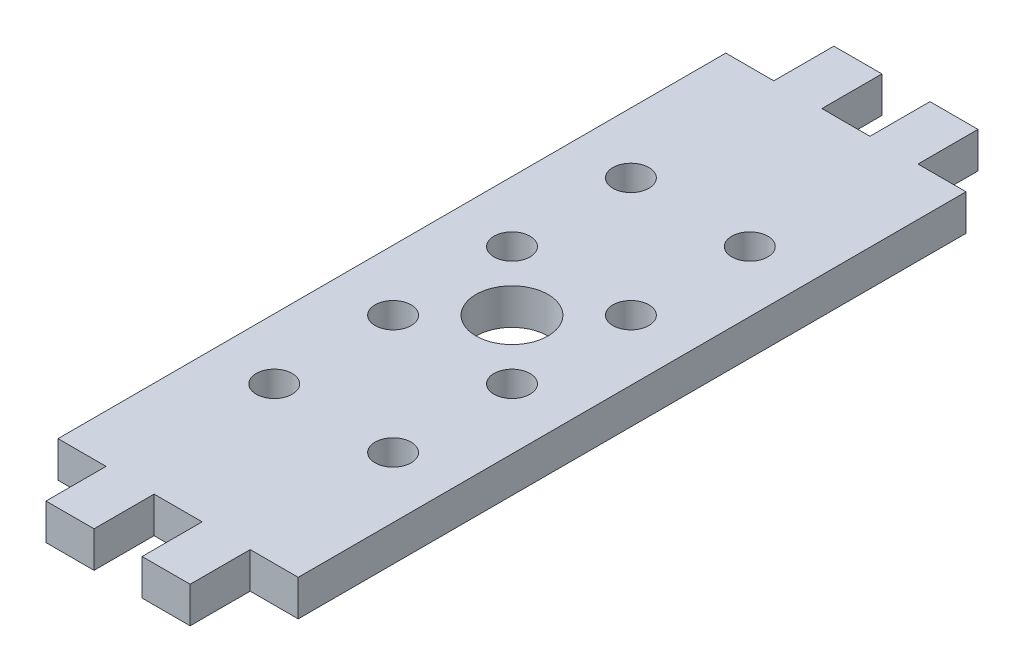
ISO-10303-21;
HEADER;
FILE_DESCRIPTION(('STEP AP214'),'2;1');
FILE_NAME('part.step','',(''),(''),'','','');
FILE_SCHEMA(('AUTOMOTIVE_DESIGN { 1 0 10303 214 1 1 1 1 }'));
ENDSEC;
DATA;
#1=APPLICATION_CONTEXT('core data for automotive mechanical design processes');
#2=APPLICATION_PROTOCOL_DEFINITION('international standard','automotive_design',2000,#1);
#3=PRODUCT_CONTEXT('',#1,'mechanical');
#4=PRODUCT('Part','Part','',(#3));
#5=PRODUCT_RELATED_PRODUCT_CATEGORY('part','',(#4));
#6=PRODUCT_DEFINITION_FORMATION('','',#4);
#7=PRODUCT_DEFINITION_CONTEXT('part definition',#1,'design');
#8=PRODUCT_DEFINITION('design','',#6,#7);
#9=PRODUCT_DEFINITION_SHAPE('','',#8);
#10=(LENGTH_UNIT() NAMED_UNIT(*) SI_UNIT(.MILLI.,.METRE.));
#11=(NAMED_UNIT(*) PLANE_ANGLE_UNIT() SI_UNIT($,.RADIAN.));
#12=(NAMED_UNIT(*) SI_UNIT($,.STERADIAN.) SOLID_ANGLE_UNIT());
#13=UNCERTAINTY_MEASURE_WITH_UNIT(LENGTH_MEASURE(1.E-05),#10,'distance_accuracy_value','');
#14=(GEOMETRIC_REPRESENTATION_CONTEXT(3) GLOBAL_UNCERTAINTY_ASSIGNED_CONTEXT((#13)) GLOBAL_UNIT_ASSIGNED_CONTEXT((#10,
#11,#12)) REPRESENTATION_CONTEXT('',''));
#15=CARTESIAN_POINT('',(0.,0.,0.));
#16=DIRECTION('',(0.,0.,1.));
#17=DIRECTION('',(1.,0.,0.));
#18=AXIS2_PLACEMENT_3D('',#15,#16,#17);
#19=CARTESIAN_POINT('',(0.,3.,0.));
#20=DIRECTION('',(0.,1.,0.));
#21=DIRECTION('',(0.,0.,1.));
#22=AXIS2_PLACEMENT_3D('',#19,#20,#21);
#23=PLANE('',#22);
#24=CARTESIAN_POINT('',(-14.9497474683059,3.,12.9507575950826));
#25=DIRECTION('',(0.,1.,0.));
#26=DIRECTION('',(0.,0.,1.));
#27=AXIS2_PLACEMENT_3D('',#24,#25,#26);
#28=CIRCLE('',#27,1.5);
#29=CARTESIAN_POINT('',(-14.9497474683059,3.,14.4507575950826));
#30=VERTEX_POINT('',#29);
#31=EDGE_CURVE('E548',#30,#30,#28,.F.);
#32=ORIENTED_EDGE('',*,*,#31,.T.);
#33=EDGE_LOOP('',(#32));
#34=FACE_BOUND('',#33,.T.);
#35=CARTESIAN_POINT('',(-5.05025253169423,3.,12.9507575950825));
#36=DIRECTION('',(0.,1.,0.));
#37=DIRECTION('',(0.,0.,1.));
#38=AXIS2_PLACEMENT_3D('',#35,#36,#37);
#39=CIRCLE('',#38,1.5);
#40=CARTESIAN_POINT('',(-5.05025253169423,3.,14.4507575950825));
#41=VERTEX_POINT('',#40);
#42=EDGE_CURVE('E210',#41,#41,#39,.F.);
#43=ORIENTED_EDGE('',*,*,#42,.T.);
#44=EDGE_LOOP('',(#43));
#45=FACE_BOUND('',#44,.T.);
#46=DIRECTION('',(0.,0.,1.));
#47=VECTOR('',#46,1.);
#48=CARTESIAN_POINT('',(-20.,3.,0.));
#49=LINE('',#48,#47);
#50=CARTESIAN_POINT('',(-20.,3.,0.));
#51=VERTEX_POINT('',#50);
#52=CARTESIAN_POINT('',(-20.,3.,55.6));
#53=VERTEX_POINT('',#52);
#54=EDGE_CURVE('E300',#51,#53,#49,.T.);
#55=ORIENTED_EDGE('',*,*,#54,.T.);
#56=DIRECTION('',(1.,0.,0.));
#57=VECTOR('',#56,1.);
#58=CARTESIAN_POINT('',(-20.,3.,55.6));
#59=LINE('',#58,#57);
#60=CARTESIAN_POINT('',(-16.,3.,55.6));
#61=VERTEX_POINT('',#60);
#62=EDGE_CURVE('E305',#53,#61,#59,.T.);
#63=ORIENTED_EDGE('',*,*,#62,.T.);
#64=DIRECTION('',(0.,0.,1.));
#65=VECTOR('',#64,1.);
#66=CARTESIAN_POINT('',(-16.,3.,0.));
#67=LINE('',#66,#65);
#68=CARTESIAN_POINT('',(-16.,3.,60.6));
#69=VERTEX_POINT('',#68);
#70=EDGE_CURVE('E214',#61,#69,#67,.T.);
#71=ORIENTED_EDGE('',*,*,#70,.T.);
#72=DIRECTION('',(-1.,0.,0.));
#73=VECTOR('',#72,1.);
#74=CARTESIAN_POINT('',(0.,3.,60.6));
#75=LINE('',#74,#73);
#76=CARTESIAN_POINT('',(-12.,3.,60.6));
#77=VERTEX_POINT('',#76);
#78=EDGE_CURVE('E199',#77,#69,#75,.T.);
#79=ORIENTED_EDGE('',*,*,#78,.F.);
#80=DIRECTION('',(0.,0.,1.));
#81=VECTOR('',#80,1.);
#82=CARTESIAN_POINT('',(-12.,3.,0.));
#83=LINE('',#82,#81);
#84=CARTESIAN_POINT('',(-12.,3.,55.6));
#85=VERTEX_POINT('',#84);
#86=EDGE_CURVE('E206',#85,#77,#83,.T.);
#87=ORIENTED_EDGE('',*,*,#86,.F.);
#88=CARTESIAN_POINT('',(-8.,3.,55.6));
#89=VERTEX_POINT('',#88);
#90=EDGE_CURVE('E59',#85,#89,#59,.T.);
#91=ORIENTED_EDGE('',*,*,#90,.T.);
#92=DIRECTION('',(0.,0.,1.));
#93=VECTOR('',#92,1.);
#94=CARTESIAN_POINT('',(-7.99999999999998,3.,0.));
#95=LINE('',#94,#93);
#96=CARTESIAN_POINT('',(-8.,3.,60.6));
#97=VERTEX_POINT('',#96);
#98=EDGE_CURVE('E220',#89,#97,#95,.T.);
#99=ORIENTED_EDGE('',*,*,#98,.T.);
#100=DIRECTION('',(1.,0.,0.));
#101=VECTOR('',#100,1.);
#102=CARTESIAN_POINT('',(0.,3.,60.6));
#103=LINE('',#102,#101);
#104=CARTESIAN_POINT('',(-4.,3.,60.6));
#105=VERTEX_POINT('',#104);
#106=EDGE_CURVE('E235',#97,#105,#103,.T.);
#107=ORIENTED_EDGE('',*,*,#106,.T.);
#108=DIRECTION('',(0.,0.,1.));
#109=VECTOR('',#108,1.);
#110=CARTESIAN_POINT('',(-4.,3.,0.));
#111=LINE('',#110,#109);
#112=CARTESIAN_POINT('',(-4.,3.,55.6));
#113=VERTEX_POINT('',#112);
#114=EDGE_CURVE('E227',#113,#105,#111,.T.);
#115=ORIENTED_EDGE('',*,*,#114,.F.);
#116=CARTESIAN_POINT('',(0.,3.,55.6));
#117=VERTEX_POINT('',#116);
#118=EDGE_CURVE('E303',#113,#117,#59,.T.);
#119=ORIENTED_EDGE('',*,*,#118,.T.);
#120=DIRECTION('',(0.,0.,-1.));
#121=VECTOR('',#120,1.);
#122=CARTESIAN_POINT('',(0.,3.,0.));
#123=LINE('',#122,#121);
#124=CARTESIAN_POINT('',(0.,3.,0.));
#125=VERTEX_POINT('',#124);
#126=EDGE_CURVE('E307',#117,#125,#123,.T.);
#127=ORIENTED_EDGE('',*,*,#126,.T.);
#128=DIRECTION('',(-1.,0.,0.));
#129=VECTOR('',#128,1.);
#130=CARTESIAN_POINT('',(-20.,3.,0.));
#131=LINE('',#130,#129);
#132=CARTESIAN_POINT('',(-4.,3.,0.));
#133=VERTEX_POINT('',#132);
#134=EDGE_CURVE('E310',#125,#133,#131,.T.);
#135=ORIENTED_EDGE('',*,*,#134,.T.);
#136=DIRECTION('',(0.,0.,-1.));
#137=VECTOR('',#136,1.);
#138=CARTESIAN_POINT('',(-4.,3.,0.));
#139=LINE('',#138,#137);
#140=CARTESIAN_POINT('',(-4.,3.,-5.00000000000001));
#141=VERTEX_POINT('',#140);
#142=EDGE_CURVE('E278',#133,#141,#139,.T.);
#143=ORIENTED_EDGE('',*,*,#142,.T.);
#144=DIRECTION('',(1.,0.,0.));
#145=VECTOR('',#144,1.);
#146=CARTESIAN_POINT('',(0.,3.,-5.00000000000001));
#147=LINE('',#146,#145);
#148=CARTESIAN_POINT('',(-8.,3.,-5.00000000000001));
#149=VERTEX_POINT('',#148);
#150=EDGE_CURVE('E269',#149,#141,#147,.T.);
#151=ORIENTED_EDGE('',*,*,#150,.F.);
#152=DIRECTION('',(0.,0.,-1.));
#153=VECTOR('',#152,1.);
#154=CARTESIAN_POINT('',(-8.,3.,0.));
#155=LINE('',#154,#153);
#156=CARTESIAN_POINT('',(-8.,3.,0.));
#157=VERTEX_POINT('',#156);
#158=EDGE_CURVE('E286',#157,#149,#155,.T.);
#159=ORIENTED_EDGE('',*,*,#158,.F.);
#160=CARTESIAN_POINT('',(-12.,3.,0.));
#161=VERTEX_POINT('',#160);
#162=EDGE_CURVE('E314',#157,#161,#131,.T.);
#163=ORIENTED_EDGE('',*,*,#162,.T.);
#164=DIRECTION('',(0.,0.,-1.));
#165=VECTOR('',#164,1.);
#166=CARTESIAN_POINT('',(-12.,3.,0.));
#167=LINE('',#166,#165);
#168=CARTESIAN_POINT('',(-12.,3.,-5.00000000000001));
#169=VERTEX_POINT('',#168);
#170=EDGE_CURVE('E243',#161,#169,#167,.T.);
#171=ORIENTED_EDGE('',*,*,#170,.T.);
#172=DIRECTION('',(-1.,0.,0.));
#173=VECTOR('',#172,1.);
#174=CARTESIAN_POINT('',(0.,3.,-5.00000000000001));
#175=LINE('',#174,#173);
#176=CARTESIAN_POINT('',(-16.,3.,-5.00000000000001));
#177=VERTEX_POINT('',#176);
#178=EDGE_CURVE('E261',#169,#177,#175,.T.);
#179=ORIENTED_EDGE('',*,*,#178,.T.);
#180=DIRECTION('',(0.,0.,-1.));
#181=VECTOR('',#180,1.);
#182=CARTESIAN_POINT('',(-16.,3.,0.));
#183=LINE('',#182,#181);
#184=CARTESIAN_POINT('',(-16.,3.,0.));
#185=VERTEX_POINT('',#184);
#186=EDGE_CURVE('E253',#185,#177,#183,.T.);
#187=ORIENTED_EDGE('',*,*,#186,.F.);
#188=EDGE_CURVE('E309',#185,#51,#131,.T.);
#189=ORIENTED_EDGE('',*,*,#188,.T.);
#190=EDGE_LOOP('',(#55,#63,#71,#79,#87,#91,#99,#107,#115,#119,#127,#135,#143,#151,#159,#163,
#171,#179,#187,#189));
#191=FACE_BOUND('',#190,.T.);
#192=CARTESIAN_POINT('',(-14.9497474683058,3.,22.8502525316943));
#193=DIRECTION('',(0.,1.,0.));
#194=DIRECTION('',(0.,0.,1.));
#195=AXIS2_PLACEMENT_3D('',#192,#193,#194);
#196=CIRCLE('',#195,1.5);
#197=CARTESIAN_POINT('',(-14.9497474683058,3.,24.3502525316943));
#198=VERTEX_POINT('',#197);
#199=EDGE_CURVE('E547',#198,#198,#196,.T.);
#200=ORIENTED_EDGE('',*,*,#199,.F.);
#201=EDGE_LOOP('',(#200));
#202=FACE_BOUND('',#201,.T.);
#203=CARTESIAN_POINT('',(-5.05025253169416,3.,22.8502525316942));
#204=DIRECTION('',(0.,1.,0.));
#205=DIRECTION('',(0.,0.,1.));
#206=AXIS2_PLACEMENT_3D('',#203,#204,#205);
#207=CIRCLE('',#206,1.5);
#208=CARTESIAN_POINT('',(-5.05025253169416,3.,24.3502525316942));
#209=VERTEX_POINT('',#208);
#210=EDGE_CURVE('E549',#209,#209,#207,.T.);
#211=ORIENTED_EDGE('',*,*,#210,.F.);
#212=EDGE_LOOP('',(#211));
#213=FACE_BOUND('',#212,.T.);
#214=CARTESIAN_POINT('',(-9.99999999999999,3.,27.8));
#215=DIRECTION('',(0.,1.,0.));
#216=DIRECTION('',(0.,0.,1.));
#217=AXIS2_PLACEMENT_3D('',#214,#215,#216);
#218=CIRCLE('',#217,3.);
#219=CARTESIAN_POINT('',(-9.99999999999999,3.,30.8));
#220=VERTEX_POINT('',#219);
#221=EDGE_CURVE('E553',#220,#220,#218,.T.);
#222=ORIENTED_EDGE('',*,*,#221,.F.);
#223=EDGE_LOOP('',(#222));
#224=FACE_BOUND('',#223,.T.);
#225=CARTESIAN_POINT('',(-5.05025253169404,3.,32.7497474683059));
#226=DIRECTION('',(0.,1.,0.));
#227=DIRECTION('',(0.,0.,1.));
#228=AXIS2_PLACEMENT_3D('',#225,#226,#227);
#229=CIRCLE('',#228,1.5);
#230=CARTESIAN_POINT('',(-5.05025253169404,3.,34.2497474683059));
#231=VERTEX_POINT('',#230);
#232=EDGE_CURVE('E558',#231,#231,#229,.T.);
#233=ORIENTED_EDGE('',*,*,#232,.F.);
#234=EDGE_LOOP('',(#233));
#235=FACE_BOUND('',#234,.T.);
#236=CARTESIAN_POINT('',(-14.9497474683057,3.,32.7497474683059));
#237=DIRECTION('',(0.,1.,0.));
#238=DIRECTION('',(0.,0.,1.));
#239=AXIS2_PLACEMENT_3D('',#236,#237,#238);
#240=CIRCLE('',#239,1.5);
#241=CARTESIAN_POINT('',(-14.9497474683057,3.,34.2497474683059));
#242=VERTEX_POINT('',#241);
#243=EDGE_CURVE('E561',#242,#242,#240,.T.);
#244=ORIENTED_EDGE('',*,*,#243,.F.);
#245=EDGE_LOOP('',(#244));
#246=FACE_BOUND('',#245,.T.);
#247=CARTESIAN_POINT('',(-5.05025253169423,3.,42.6492424049175));
#248=DIRECTION('',(0.,1.,0.));
#249=DIRECTION('',(0.,0.,1.));
#250=AXIS2_PLACEMENT_3D('',#247,#248,#249);
#251=CIRCLE('',#250,1.5);
#252=CARTESIAN_POINT('',(-5.05025253169423,3.,44.1492424049175));
#253=VERTEX_POINT('',#252);
#254=EDGE_CURVE('E563',#253,#253,#251,.T.);
#255=ORIENTED_EDGE('',*,*,#254,.F.);
#256=EDGE_LOOP('',(#255));
#257=FACE_BOUND('',#256,.T.);
#258=CARTESIAN_POINT('',(-14.9497474683059,3.,42.6492424049174));
#259=DIRECTION('',(0.,1.,0.));
#260=DIRECTION('',(0.,0.,1.));
#261=AXIS2_PLACEMENT_3D('',#258,#259,#260);
#262=CIRCLE('',#261,1.5);
#263=CARTESIAN_POINT('',(-14.9497474683059,3.,44.1492424049174));
#264=VERTEX_POINT('',#263);
#265=EDGE_CURVE('E565',#264,#264,#262,.T.);
#266=ORIENTED_EDGE('',*,*,#265,.F.);
#267=EDGE_LOOP('',(#266));
#268=FACE_BOUND('',#267,.T.);
#269=ADVANCED_FACE('F42',(#34,#45,#191,#202,#213,#224,#235,#246,#257,#268),#23,.T.);
#270=CARTESIAN_POINT('',(0.,0.,0.));
#271=DIRECTION('',(0.,1.,0.));
#272=DIRECTION('',(0.,0.,1.));
#273=AXIS2_PLACEMENT_3D('',#270,#271,#272);
#274=PLANE('',#273);
#275=CARTESIAN_POINT('',(-5.05025253169423,0.,42.6492424049175));
#276=DIRECTION('',(0.,1.,0.));
#277=DIRECTION('',(0.,0.,1.));
#278=AXIS2_PLACEMENT_3D('',#275,#276,#277);
#279=CIRCLE('',#278,1.5);
#280=CARTESIAN_POINT('',(-5.05025253169423,0.,44.1492424049175));
#281=VERTEX_POINT('',#280);
#282=EDGE_CURVE('E354',#281,#281,#279,.T.);
#283=ORIENTED_EDGE('',*,*,#282,.T.);
#284=EDGE_LOOP('',(#283));
#285=FACE_BOUND('',#284,.T.);
#286=CARTESIAN_POINT('',(-5.05025253169404,0.,32.7497474683059));
#287=DIRECTION('',(0.,1.,0.));
#288=DIRECTION('',(0.,0.,1.));
#289=AXIS2_PLACEMENT_3D('',#286,#287,#288);
#290=CIRCLE('',#289,1.5);
#291=CARTESIAN_POINT('',(-5.05025253169404,0.,34.2497474683059));
#292=VERTEX_POINT('',#291);
#293=EDGE_CURVE('E349',#292,#292,#290,.T.);
#294=ORIENTED_EDGE('',*,*,#293,.T.);
#295=EDGE_LOOP('',(#294));
#296=FACE_BOUND('',#295,.T.);
#297=CARTESIAN_POINT('',(-5.05025253169416,0.,22.8502525316942));
#298=DIRECTION('',(0.,1.,0.));
#299=DIRECTION('',(0.,0.,1.));
#300=AXIS2_PLACEMENT_3D('',#297,#298,#299);
#301=CIRCLE('',#300,1.5);
#302=CARTESIAN_POINT('',(-5.05025253169416,0.,24.3502525316942));
#303=VERTEX_POINT('',#302);
#304=EDGE_CURVE('E343',#303,#303,#301,.T.);
#305=ORIENTED_EDGE('',*,*,#304,.T.);
#306=EDGE_LOOP('',(#305));
#307=FACE_BOUND('',#306,.T.);
#308=DIRECTION('',(0.,0.,1.));
#309=VECTOR('',#308,1.);
#310=CARTESIAN_POINT('',(-20.,0.,0.));
#311=LINE('',#310,#309);
#312=CARTESIAN_POINT('',(-20.,0.,0.));
#313=VERTEX_POINT('',#312);
#314=CARTESIAN_POINT('',(-20.,0.,55.6));
#315=VERTEX_POINT('',#314);
#316=EDGE_CURVE('E292',#313,#315,#311,.T.);
#317=ORIENTED_EDGE('',*,*,#316,.F.);
#318=DIRECTION('',(-1.,0.,0.));
#319=VECTOR('',#318,1.);
#320=CARTESIAN_POINT('',(-20.,0.,0.));
#321=LINE('',#320,#319);
#322=CARTESIAN_POINT('',(-16.,0.,0.));
#323=VERTEX_POINT('',#322);
#324=EDGE_CURVE('E323',#323,#313,#321,.T.);
#325=ORIENTED_EDGE('',*,*,#324,.F.);
#326=DIRECTION('',(0.,0.,-1.));
#327=VECTOR('',#326,1.);
#328=CARTESIAN_POINT('',(-16.,0.,0.));
#329=LINE('',#328,#327);
#330=CARTESIAN_POINT('',(-16.,0.,-5.00000000000001));
#331=VERTEX_POINT('',#330);
#332=EDGE_CURVE('E256',#323,#331,#329,.T.);
#333=ORIENTED_EDGE('',*,*,#332,.T.);
#334=DIRECTION('',(-1.,0.,0.));
#335=VECTOR('',#334,1.);
#336=CARTESIAN_POINT('',(0.,0.,-5.00000000000001));
#337=LINE('',#336,#335);
#338=CARTESIAN_POINT('',(-12.,0.,-5.00000000000001));
#339=VERTEX_POINT('',#338);
#340=EDGE_CURVE('E252',#339,#331,#337,.T.);
#341=ORIENTED_EDGE('',*,*,#340,.F.);
#342=DIRECTION('',(0.,0.,-1.));
#343=VECTOR('',#342,1.);
#344=CARTESIAN_POINT('',(-12.,0.,0.));
#345=LINE('',#344,#343);
#346=CARTESIAN_POINT('',(-12.,0.,0.));
#347=VERTEX_POINT('',#346);
#348=EDGE_CURVE('E249',#347,#339,#345,.T.);
#349=ORIENTED_EDGE('',*,*,#348,.F.);
#350=CARTESIAN_POINT('',(-8.,0.,0.));
#351=VERTEX_POINT('',#350);
#352=EDGE_CURVE('E326',#351,#347,#321,.T.);
#353=ORIENTED_EDGE('',*,*,#352,.F.);
#354=DIRECTION('',(0.,0.,-1.));
#355=VECTOR('',#354,1.);
#356=CARTESIAN_POINT('',(-8.,0.,0.));
#357=LINE('',#356,#355);
#358=CARTESIAN_POINT('',(-8.,0.,-5.00000000000001));
#359=VERTEX_POINT('',#358);
#360=EDGE_CURVE('E277',#351,#359,#357,.T.);
#361=ORIENTED_EDGE('',*,*,#360,.T.);
#362=DIRECTION('',(1.,0.,0.));
#363=VECTOR('',#362,1.);
#364=CARTESIAN_POINT('',(0.,0.,-5.00000000000001));
#365=LINE('',#364,#363);
#366=CARTESIAN_POINT('',(-4.,0.,-5.00000000000001));
#367=VERTEX_POINT('',#366);
#368=EDGE_CURVE('E275',#359,#367,#365,.T.);
#369=ORIENTED_EDGE('',*,*,#368,.T.);
#370=DIRECTION('',(0.,0.,-1.));
#371=VECTOR('',#370,1.);
#372=CARTESIAN_POINT('',(-4.,0.,0.));
#373=LINE('',#372,#371);
#374=CARTESIAN_POINT('',(-4.,0.,0.));
#375=VERTEX_POINT('',#374);
#376=EDGE_CURVE('E280',#375,#367,#373,.T.);
#377=ORIENTED_EDGE('',*,*,#376,.F.);
#378=CARTESIAN_POINT('',(0.,0.,0.));
#379=VERTEX_POINT('',#378);
#380=EDGE_CURVE('E304',#379,#375,#321,.T.);
#381=ORIENTED_EDGE('',*,*,#380,.F.);
#382=DIRECTION('',(0.,0.,-1.));
#383=VECTOR('',#382,1.);
#384=CARTESIAN_POINT('',(0.,0.,0.));
#385=LINE('',#384,#383);
#386=CARTESIAN_POINT('',(0.,0.,55.6));
#387=VERTEX_POINT('',#386);
#388=EDGE_CURVE('E320',#387,#379,#385,.T.);
#389=ORIENTED_EDGE('',*,*,#388,.F.);
#390=DIRECTION('',(1.,0.,0.));
#391=VECTOR('',#390,1.);
#392=CARTESIAN_POINT('',(-20.,0.,55.6));
#393=LINE('',#392,#391);
#394=CARTESIAN_POINT('',(-4.,0.,55.6));
#395=VERTEX_POINT('',#394);
#396=EDGE_CURVE('E317',#395,#387,#393,.T.);
#397=ORIENTED_EDGE('',*,*,#396,.F.);
#398=DIRECTION('',(0.,0.,1.));
#399=VECTOR('',#398,1.);
#400=CARTESIAN_POINT('',(-4.,0.,0.));
#401=LINE('',#400,#399);
#402=CARTESIAN_POINT('',(-4.,0.,60.6));
#403=VERTEX_POINT('',#402);
#404=EDGE_CURVE('E230',#395,#403,#401,.T.);
#405=ORIENTED_EDGE('',*,*,#404,.T.);
#406=DIRECTION('',(1.,0.,0.));
#407=VECTOR('',#406,1.);
#408=CARTESIAN_POINT('',(0.,0.,60.6));
#409=LINE('',#408,#407);
#410=CARTESIAN_POINT('',(-8.,0.,60.6));
#411=VERTEX_POINT('',#410);
#412=EDGE_CURVE('E226',#411,#403,#409,.T.);
#413=ORIENTED_EDGE('',*,*,#412,.F.);
#414=DIRECTION('',(0.,0.,1.));
#415=VECTOR('',#414,1.);
#416=CARTESIAN_POINT('',(-7.99999999999998,0.,0.));
#417=LINE('',#416,#415);
#418=CARTESIAN_POINT('',(-8.,0.,55.6));
#419=VERTEX_POINT('',#418);
#420=EDGE_CURVE('E223',#419,#411,#417,.T.);
#421=ORIENTED_EDGE('',*,*,#420,.F.);
#422=CARTESIAN_POINT('',(-12.,0.,55.6));
#423=VERTEX_POINT('',#422);
#424=EDGE_CURVE('E321',#423,#419,#393,.T.);
#425=ORIENTED_EDGE('',*,*,#424,.F.);
#426=DIRECTION('',(0.,0.,1.));
#427=VECTOR('',#426,1.);
#428=CARTESIAN_POINT('',(-12.,0.,0.));
#429=LINE('',#428,#427);
#430=CARTESIAN_POINT('',(-12.,0.,60.6));
#431=VERTEX_POINT('',#430);
#432=EDGE_CURVE('E190',#423,#431,#429,.T.);
#433=ORIENTED_EDGE('',*,*,#432,.T.);
#434=DIRECTION('',(-1.,0.,0.));
#435=VECTOR('',#434,1.);
#436=CARTESIAN_POINT('',(0.,0.,60.6));
#437=LINE('',#436,#435);
#438=CARTESIAN_POINT('',(-16.,0.,60.6));
#439=VERTEX_POINT('',#438);
#440=EDGE_CURVE('E182',#431,#439,#437,.T.);
#441=ORIENTED_EDGE('',*,*,#440,.T.);
#442=DIRECTION('',(0.,0.,1.));
#443=VECTOR('',#442,1.);
#444=CARTESIAN_POINT('',(-16.,0.,0.));
#445=LINE('',#444,#443);
#446=CARTESIAN_POINT('',(-16.,0.,55.6));
#447=VERTEX_POINT('',#446);
#448=EDGE_CURVE('E188',#447,#439,#445,.T.);
#449=ORIENTED_EDGE('',*,*,#448,.F.);
#450=EDGE_CURVE('E318',#315,#447,#393,.T.);
#451=ORIENTED_EDGE('',*,*,#450,.F.);
#452=EDGE_LOOP('',(#317,#325,#333,#341,#349,#353,#361,#369,#377,#381,#389,#397,#405,#413,#421,
#425,#433,#441,#449,#451));
#453=FACE_BOUND('',#452,.T.);
#454=CARTESIAN_POINT('',(-5.05025253169423,0.,12.9507575950825));
#455=DIRECTION('',(0.,1.,0.));
#456=DIRECTION('',(0.,0.,1.));
#457=AXIS2_PLACEMENT_3D('',#454,#455,#456);
#458=CIRCLE('',#457,1.5);
#459=CARTESIAN_POINT('',(-5.05025253169423,0.,14.4507575950825));
#460=VERTEX_POINT('',#459);
#461=EDGE_CURVE('E334',#460,#460,#458,.F.);
#462=ORIENTED_EDGE('',*,*,#461,.F.);
#463=EDGE_LOOP('',(#462));
#464=FACE_BOUND('',#463,.T.);
#465=CARTESIAN_POINT('',(-14.9497474683059,0.,12.9507575950826));
#466=DIRECTION('',(0.,1.,0.));
#467=DIRECTION('',(0.,0.,1.));
#468=AXIS2_PLACEMENT_3D('',#465,#466,#467);
#469=CIRCLE('',#468,1.5);
#470=CARTESIAN_POINT('',(-14.9497474683059,0.,14.4507575950826));
#471=VERTEX_POINT('',#470);
#472=EDGE_CURVE('E337',#471,#471,#469,.F.);
#473=ORIENTED_EDGE('',*,*,#472,.F.);
#474=EDGE_LOOP('',(#473));
#475=FACE_BOUND('',#474,.T.);
#476=CARTESIAN_POINT('',(-14.9497474683058,0.,22.8502525316943));
#477=DIRECTION('',(0.,1.,0.));
#478=DIRECTION('',(0.,0.,1.));
#479=AXIS2_PLACEMENT_3D('',#476,#477,#478);
#480=CIRCLE('',#479,1.5);
#481=CARTESIAN_POINT('',(-14.9497474683058,0.,24.3502525316943));
#482=VERTEX_POINT('',#481);
#483=EDGE_CURVE('E340',#482,#482,#480,.T.);
#484=ORIENTED_EDGE('',*,*,#483,.T.);
#485=EDGE_LOOP('',(#484));
#486=FACE_BOUND('',#485,.T.);
#487=CARTESIAN_POINT('',(-9.99999999999999,0.,27.8));
#488=DIRECTION('',(0.,1.,0.));
#489=DIRECTION('',(0.,0.,1.));
#490=AXIS2_PLACEMENT_3D('',#487,#488,#489);
#491=CIRCLE('',#490,3.);
#492=CARTESIAN_POINT('',(-9.99999999999999,0.,30.8));
#493=VERTEX_POINT('',#492);
#494=EDGE_CURVE('E346',#493,#493,#491,.T.);
#495=ORIENTED_EDGE('',*,*,#494,.T.);
#496=EDGE_LOOP('',(#495));
#497=FACE_BOUND('',#496,.T.);
#498=CARTESIAN_POINT('',(-14.9497474683057,0.,32.7497474683059));
#499=DIRECTION('',(0.,1.,0.));
#500=DIRECTION('',(0.,0.,1.));
#501=AXIS2_PLACEMENT_3D('',#498,#499,#500);
#502=CIRCLE('',#501,1.5);
#503=CARTESIAN_POINT('',(-14.9497474683057,0.,34.2497474683059));
#504=VERTEX_POINT('',#503);
#505=EDGE_CURVE('E352',#504,#504,#502,.T.);
#506=ORIENTED_EDGE('',*,*,#505,.T.);
#507=EDGE_LOOP('',(#506));
#508=FACE_BOUND('',#507,.T.);
#509=CARTESIAN_POINT('',(-14.9497474683059,0.,42.6492424049174));
#510=DIRECTION('',(0.,1.,0.));
#511=DIRECTION('',(0.,0.,1.));
#512=AXIS2_PLACEMENT_3D('',#509,#510,#511);
#513=CIRCLE('',#512,1.5);
#514=CARTESIAN_POINT('',(-14.9497474683059,0.,44.1492424049174));
#515=VERTEX_POINT('',#514);
#516=EDGE_CURVE('E46',#515,#515,#513,.T.);
#517=ORIENTED_EDGE('',*,*,#516,.T.);
#518=EDGE_LOOP('',(#517));
#519=FACE_BOUND('',#518,.T.);
#520=ADVANCED_FACE('F185',(#285,#296,#307,#453,#464,#475,#486,#497,#508,#519),#274,.F.);
#521=CARTESIAN_POINT('',(-20.,3.,55.6));
#522=DIRECTION('',(0.,0.,-1.));
#523=DIRECTION('',(-1.,0.,0.));
#524=AXIS2_PLACEMENT_3D('',#521,#522,#523);
#525=PLANE('',#524);
#526=DIRECTION('',(0.,1.,0.));
#527=VECTOR('',#526,1.);
#528=CARTESIAN_POINT('',(-12.,0.,55.6));
#529=LINE('',#528,#527);
#530=EDGE_CURVE('E217',#423,#85,#529,.T.);
#531=ORIENTED_EDGE('',*,*,#530,.F.);
#532=ORIENTED_EDGE('',*,*,#424,.T.);
#533=DIRECTION('',(0.,1.,0.));
#534=VECTOR('',#533,1.);
#535=CARTESIAN_POINT('',(-8.,0.,55.6));
#536=LINE('',#535,#534);
#537=EDGE_CURVE('E232',#419,#89,#536,.T.);
#538=ORIENTED_EDGE('',*,*,#537,.T.);
#539=ORIENTED_EDGE('',*,*,#90,.F.);
#540=EDGE_LOOP('',(#531,#532,#538,#539));
#541=FACE_BOUND('',#540,.T.);
#542=ADVANCED_FACE('F381',(#541),#525,.F.);
#543=DIRECTION('',(0.,1.,0.));
#544=VECTOR('',#543,1.);
#545=CARTESIAN_POINT('',(-4.,0.,55.6));
#546=LINE('',#545,#544);
#547=EDGE_CURVE('E240',#395,#113,#546,.T.);
#548=ORIENTED_EDGE('',*,*,#547,.F.);
#549=ORIENTED_EDGE('',*,*,#396,.T.);
#550=DIRECTION('',(0.,-1.,0.));
#551=VECTOR('',#550,1.);
#552=CARTESIAN_POINT('',(0.,3.,55.6));
#553=LINE('',#552,#551);
#554=EDGE_CURVE('E51',#117,#387,#553,.T.);
#555=ORIENTED_EDGE('',*,*,#554,.F.);
#556=ORIENTED_EDGE('',*,*,#118,.F.);
#557=EDGE_LOOP('',(#548,#549,#555,#556));
#558=FACE_BOUND('',#557,.T.);
#559=ADVANCED_FACE('F400',(#558),#525,.F.);
#560=CARTESIAN_POINT('',(-20.,3.,0.));
#561=DIRECTION('',(0.,0.,1.));
#562=DIRECTION('',(1.,0.,0.));
#563=AXIS2_PLACEMENT_3D('',#560,#561,#562);
#564=PLANE('',#563);
#565=DIRECTION('',(0.,1.,0.));
#566=VECTOR('',#565,1.);
#567=CARTESIAN_POINT('',(-16.,0.,0.));
#568=LINE('',#567,#566);
#569=EDGE_CURVE('E266',#323,#185,#568,.T.);
#570=ORIENTED_EDGE('',*,*,#569,.F.);
#571=ORIENTED_EDGE('',*,*,#324,.T.);
#572=DIRECTION('',(0.,-1.,0.));
#573=VECTOR('',#572,1.);
#574=CARTESIAN_POINT('',(-20.,3.,0.));
#575=LINE('',#574,#573);
#576=EDGE_CURVE('E313',#51,#313,#575,.T.);
#577=ORIENTED_EDGE('',*,*,#576,.F.);
#578=ORIENTED_EDGE('',*,*,#188,.F.);
#579=EDGE_LOOP('',(#570,#571,#577,#578));
#580=FACE_BOUND('',#579,.T.);
#581=ADVANCED_FACE('F394',(#580),#564,.F.);
#582=ORIENTED_EDGE('',*,*,#352,.T.);
#583=DIRECTION('',(0.,1.,0.));
#584=VECTOR('',#583,1.);
#585=CARTESIAN_POINT('',(-12.,0.,0.));
#586=LINE('',#585,#584);
#587=EDGE_CURVE('E258',#347,#161,#586,.T.);
#588=ORIENTED_EDGE('',*,*,#587,.T.);
#589=ORIENTED_EDGE('',*,*,#162,.F.);
#590=DIRECTION('',(0.,1.,0.));
#591=VECTOR('',#590,1.);
#592=CARTESIAN_POINT('',(-8.,0.,0.));
#593=LINE('',#592,#591);
#594=EDGE_CURVE('E296',#351,#157,#593,.T.);
#595=ORIENTED_EDGE('',*,*,#594,.F.);
#596=EDGE_LOOP('',(#582,#588,#589,#595));
#597=FACE_BOUND('',#596,.T.);
#598=ADVANCED_FACE('F395',(#597),#564,.F.);
#599=CARTESIAN_POINT('',(-20.,3.,0.));
#600=DIRECTION('',(1.,0.,0.));
#601=DIRECTION('',(0.,0.,-1.));
#602=AXIS2_PLACEMENT_3D('',#599,#600,#601);
#603=PLANE('',#602);
#604=ORIENTED_EDGE('',*,*,#316,.T.);
#605=DIRECTION('',(0.,-1.,0.));
#606=VECTOR('',#605,1.);
#607=CARTESIAN_POINT('',(-20.,3.,55.6));
#608=LINE('',#607,#606);
#609=EDGE_CURVE('E11',#53,#315,#608,.T.);
#610=ORIENTED_EDGE('',*,*,#609,.F.);
#611=ORIENTED_EDGE('',*,*,#54,.F.);
#612=ORIENTED_EDGE('',*,*,#576,.T.);
#613=EDGE_LOOP('',(#604,#610,#611,#612));
#614=FACE_BOUND('',#613,.T.);
#615=ADVANCED_FACE('F44',(#614),#603,.F.);
#616=ORIENTED_EDGE('',*,*,#450,.T.);
#617=DIRECTION('',(0.,1.,0.));
#618=VECTOR('',#617,1.);
#619=CARTESIAN_POINT('',(-16.,0.,55.6));
#620=LINE('',#619,#618);
#621=EDGE_CURVE('E67',#447,#61,#620,.T.);
#622=ORIENTED_EDGE('',*,*,#621,.T.);
#623=ORIENTED_EDGE('',*,*,#62,.F.);
#624=ORIENTED_EDGE('',*,*,#609,.T.);
#625=EDGE_LOOP('',(#616,#622,#623,#624));
#626=FACE_BOUND('',#625,.T.);
#627=ADVANCED_FACE('F397',(#626),#525,.F.);
#628=CARTESIAN_POINT('',(0.,3.,0.));
#629=DIRECTION('',(-1.,0.,0.));
#630=DIRECTION('',(0.,0.,1.));
#631=AXIS2_PLACEMENT_3D('',#628,#629,#630);
#632=PLANE('',#631);
#633=ORIENTED_EDGE('',*,*,#388,.T.);
#634=DIRECTION('',(0.,-1.,0.));
#635=VECTOR('',#634,1.);
#636=CARTESIAN_POINT('',(0.,3.,0.));
#637=LINE('',#636,#635);
#638=EDGE_CURVE('E329',#125,#379,#637,.T.);
#639=ORIENTED_EDGE('',*,*,#638,.F.);
#640=ORIENTED_EDGE('',*,*,#126,.F.);
#641=ORIENTED_EDGE('',*,*,#554,.T.);
#642=EDGE_LOOP('',(#633,#639,#640,#641));
#643=FACE_BOUND('',#642,.T.);
#644=ADVANCED_FACE('F392',(#643),#632,.F.);
#645=ORIENTED_EDGE('',*,*,#380,.T.);
#646=DIRECTION('',(0.,1.,0.));
#647=VECTOR('',#646,1.);
#648=CARTESIAN_POINT('',(-4.,0.,0.));
#649=LINE('',#648,#647);
#650=EDGE_CURVE('E293',#375,#133,#649,.T.);
#651=ORIENTED_EDGE('',*,*,#650,.T.);
#652=ORIENTED_EDGE('',*,*,#134,.F.);
#653=ORIENTED_EDGE('',*,*,#638,.T.);
#654=EDGE_LOOP('',(#645,#651,#652,#653));
#655=FACE_BOUND('',#654,.T.);
#656=ADVANCED_FACE('F389',(#655),#564,.F.);
#657=CARTESIAN_POINT('',(0.,0.,-5.00000000000001));
#658=DIRECTION('',(0.,0.,1.));
#659=DIRECTION('',(1.,0.,0.));
#660=AXIS2_PLACEMENT_3D('',#657,#658,#659);
#661=PLANE('',#660);
#662=ORIENTED_EDGE('',*,*,#150,.T.);
#663=DIRECTION('',(0.,1.,0.));
#664=VECTOR('',#663,1.);
#665=CARTESIAN_POINT('',(-4.,0.,-5.00000000000001));
#666=LINE('',#665,#664);
#667=EDGE_CURVE('E290',#367,#141,#666,.T.);
#668=ORIENTED_EDGE('',*,*,#667,.F.);
#669=ORIENTED_EDGE('',*,*,#368,.F.);
#670=DIRECTION('',(0.,1.,0.));
#671=VECTOR('',#670,1.);
#672=CARTESIAN_POINT('',(-8.,0.,-5.00000000000001));
#673=LINE('',#672,#671);
#674=EDGE_CURVE('E283',#359,#149,#673,.T.);
#675=ORIENTED_EDGE('',*,*,#674,.T.);
#676=EDGE_LOOP('',(#662,#668,#669,#675));
#677=FACE_BOUND('',#676,.T.);
#678=ADVANCED_FACE('F386',(#677),#661,.F.);
#679=CARTESIAN_POINT('',(-4.,0.,0.));
#680=DIRECTION('',(1.,0.,0.));
#681=DIRECTION('',(0.,0.,-1.));
#682=AXIS2_PLACEMENT_3D('',#679,#680,#681);
#683=PLANE('',#682);
#684=ORIENTED_EDGE('',*,*,#142,.F.);
#685=ORIENTED_EDGE('',*,*,#650,.F.);
#686=ORIENTED_EDGE('',*,*,#376,.T.);
#687=ORIENTED_EDGE('',*,*,#667,.T.);
#688=EDGE_LOOP('',(#684,#685,#686,#687));
#689=FACE_BOUND('',#688,.T.);
#690=ADVANCED_FACE('F437',(#689),#683,.T.);
#691=CARTESIAN_POINT('',(-8.,0.,0.));
#692=DIRECTION('',(1.,0.,0.));
#693=DIRECTION('',(0.,0.,-1.));
#694=AXIS2_PLACEMENT_3D('',#691,#692,#693);
#695=PLANE('',#694);
#696=ORIENTED_EDGE('',*,*,#158,.T.);
#697=ORIENTED_EDGE('',*,*,#674,.F.);
#698=ORIENTED_EDGE('',*,*,#360,.F.);
#699=ORIENTED_EDGE('',*,*,#594,.T.);
#700=EDGE_LOOP('',(#696,#697,#698,#699));
#701=FACE_BOUND('',#700,.T.);
#702=ADVANCED_FACE('F444',(#701),#695,.F.);
#703=CARTESIAN_POINT('',(-16.,0.,0.));
#704=DIRECTION('',(1.,0.,0.));
#705=DIRECTION('',(0.,0.,-1.));
#706=AXIS2_PLACEMENT_3D('',#703,#704,#705);
#707=PLANE('',#706);
#708=ORIENTED_EDGE('',*,*,#186,.T.);
#709=DIRECTION('',(0.,1.,0.));
#710=VECTOR('',#709,1.);
#711=CARTESIAN_POINT('',(-16.,0.,-5.00000000000001));
#712=LINE('',#711,#710);
#713=EDGE_CURVE('E270',#331,#177,#712,.T.);
#714=ORIENTED_EDGE('',*,*,#713,.F.);
#715=ORIENTED_EDGE('',*,*,#332,.F.);
#716=ORIENTED_EDGE('',*,*,#569,.T.);
#717=EDGE_LOOP('',(#708,#714,#715,#716));
#718=FACE_BOUND('',#717,.T.);
#719=ADVANCED_FACE('F461',(#718),#707,.F.);
#720=CARTESIAN_POINT('',(0.,0.,-5.00000000000001));
#721=DIRECTION('',(0.,0.,-1.));
#722=DIRECTION('',(-1.,0.,0.));
#723=AXIS2_PLACEMENT_3D('',#720,#721,#722);
#724=PLANE('',#723);
#725=ORIENTED_EDGE('',*,*,#178,.F.);
#726=DIRECTION('',(0.,1.,0.));
#727=VECTOR('',#726,1.);
#728=CARTESIAN_POINT('',(-12.,0.,-5.00000000000001));
#729=LINE('',#728,#727);
#730=EDGE_CURVE('E272',#339,#169,#729,.T.);
#731=ORIENTED_EDGE('',*,*,#730,.F.);
#732=ORIENTED_EDGE('',*,*,#340,.T.);
#733=ORIENTED_EDGE('',*,*,#713,.T.);
#734=EDGE_LOOP('',(#725,#731,#732,#733));
#735=FACE_BOUND('',#734,.T.);
#736=ADVANCED_FACE('F464',(#735),#724,.T.);
#737=CARTESIAN_POINT('',(-12.,0.,0.));
#738=DIRECTION('',(1.,0.,0.));
#739=DIRECTION('',(0.,0.,-1.));
#740=AXIS2_PLACEMENT_3D('',#737,#738,#739);
#741=PLANE('',#740);
#742=ORIENTED_EDGE('',*,*,#170,.F.);
#743=ORIENTED_EDGE('',*,*,#587,.F.);
#744=ORIENTED_EDGE('',*,*,#348,.T.);
#745=ORIENTED_EDGE('',*,*,#730,.T.);
#746=EDGE_LOOP('',(#742,#743,#744,#745));
#747=FACE_BOUND('',#746,.T.);
#748=ADVANCED_FACE('F467',(#747),#741,.T.);
#749=CARTESIAN_POINT('',(-4.,0.,0.));
#750=DIRECTION('',(-1.,0.,0.));
#751=DIRECTION('',(0.,0.,1.));
#752=AXIS2_PLACEMENT_3D('',#749,#750,#751);
#753=PLANE('',#752);
#754=ORIENTED_EDGE('',*,*,#114,.T.);
#755=DIRECTION('',(0.,1.,0.));
#756=VECTOR('',#755,1.);
#757=CARTESIAN_POINT('',(-4.,0.,60.6));
#758=LINE('',#757,#756);
#759=EDGE_CURVE('E244',#403,#105,#758,.T.);
#760=ORIENTED_EDGE('',*,*,#759,.F.);
#761=ORIENTED_EDGE('',*,*,#404,.F.);
#762=ORIENTED_EDGE('',*,*,#547,.T.);
#763=EDGE_LOOP('',(#754,#760,#761,#762));
#764=FACE_BOUND('',#763,.T.);
#765=ADVANCED_FACE('F469',(#764),#753,.F.);
#766=CARTESIAN_POINT('',(0.,0.,60.6));
#767=DIRECTION('',(0.,0.,1.));
#768=DIRECTION('',(1.,0.,0.));
#769=AXIS2_PLACEMENT_3D('',#766,#767,#768);
#770=PLANE('',#769);
#771=ORIENTED_EDGE('',*,*,#106,.F.);
#772=DIRECTION('',(0.,1.,0.));
#773=VECTOR('',#772,1.);
#774=CARTESIAN_POINT('',(-8.,0.,60.6));
#775=LINE('',#774,#773);
#776=EDGE_CURVE('E246',#411,#97,#775,.T.);
#777=ORIENTED_EDGE('',*,*,#776,.F.);
#778=ORIENTED_EDGE('',*,*,#412,.T.);
#779=ORIENTED_EDGE('',*,*,#759,.T.);
#780=EDGE_LOOP('',(#771,#777,#778,#779));
#781=FACE_BOUND('',#780,.T.);
#782=ADVANCED_FACE('F428',(#781),#770,.T.);
#783=CARTESIAN_POINT('',(-7.99999999999998,0.,0.));
#784=DIRECTION('',(-1.,0.,0.));
#785=DIRECTION('',(0.,0.,1.));
#786=AXIS2_PLACEMENT_3D('',#783,#784,#785);
#787=PLANE('',#786);
#788=ORIENTED_EDGE('',*,*,#98,.F.);
#789=ORIENTED_EDGE('',*,*,#537,.F.);
#790=ORIENTED_EDGE('',*,*,#420,.T.);
#791=ORIENTED_EDGE('',*,*,#776,.T.);
#792=EDGE_LOOP('',(#788,#789,#790,#791));
#793=FACE_BOUND('',#792,.T.);
#794=ADVANCED_FACE('F425',(#793),#787,.T.);
#795=CARTESIAN_POINT('',(-12.,0.,0.));
#796=DIRECTION('',(-1.,0.,0.));
#797=DIRECTION('',(0.,0.,1.));
#798=AXIS2_PLACEMENT_3D('',#795,#796,#797);
#799=PLANE('',#798);
#800=ORIENTED_EDGE('',*,*,#86,.T.);
#801=DIRECTION('',(0.,1.,0.));
#802=VECTOR('',#801,1.);
#803=CARTESIAN_POINT('',(-12.,0.,60.6));
#804=LINE('',#803,#802);
#805=EDGE_CURVE('E203',#431,#77,#804,.T.);
#806=ORIENTED_EDGE('',*,*,#805,.F.);
#807=ORIENTED_EDGE('',*,*,#432,.F.);
#808=ORIENTED_EDGE('',*,*,#530,.T.);
#809=EDGE_LOOP('',(#800,#806,#807,#808));
#810=FACE_BOUND('',#809,.T.);
#811=ADVANCED_FACE('F489',(#810),#799,.F.);
#812=CARTESIAN_POINT('',(0.,0.,60.6));
#813=DIRECTION('',(0.,0.,-1.));
#814=DIRECTION('',(-1.,0.,0.));
#815=AXIS2_PLACEMENT_3D('',#812,#813,#814);
#816=PLANE('',#815);
#817=ORIENTED_EDGE('',*,*,#78,.T.);
#818=DIRECTION('',(0.,1.,0.));
#819=VECTOR('',#818,1.);
#820=CARTESIAN_POINT('',(-16.,0.,60.6));
#821=LINE('',#820,#819);
#822=EDGE_CURVE('E196',#439,#69,#821,.T.);
#823=ORIENTED_EDGE('',*,*,#822,.F.);
#824=ORIENTED_EDGE('',*,*,#440,.F.);
#825=ORIENTED_EDGE('',*,*,#805,.T.);
#826=EDGE_LOOP('',(#817,#823,#824,#825));
#827=FACE_BOUND('',#826,.T.);
#828=ADVANCED_FACE('F197',(#827),#816,.F.);
#829=CARTESIAN_POINT('',(-16.,0.,0.));
#830=DIRECTION('',(-1.,0.,0.));
#831=DIRECTION('',(0.,0.,1.));
#832=AXIS2_PLACEMENT_3D('',#829,#830,#831);
#833=PLANE('',#832);
#834=ORIENTED_EDGE('',*,*,#70,.F.);
#835=ORIENTED_EDGE('',*,*,#621,.F.);
#836=ORIENTED_EDGE('',*,*,#448,.T.);
#837=ORIENTED_EDGE('',*,*,#822,.T.);
#838=EDGE_LOOP('',(#834,#835,#836,#837));
#839=FACE_BOUND('',#838,.T.);
#840=ADVANCED_FACE('F205',(#839),#833,.T.);
#841=CARTESIAN_POINT('',(-5.05025253169423,-7.,12.9507575950825));
#842=DIRECTION('',(0.,1.,0.));
#843=DIRECTION('',(0.,0.,1.));
#844=AXIS2_PLACEMENT_3D('',#841,#842,#843);
#845=CYLINDRICAL_SURFACE('',#844,1.5);
#846=ORIENTED_EDGE('',*,*,#42,.F.);
#847=EDGE_LOOP('',(#846));
#848=FACE_BOUND('',#847,.T.);
#849=ORIENTED_EDGE('',*,*,#461,.T.);
#850=EDGE_LOOP('',(#849));
#851=FACE_BOUND('',#850,.T.);
#852=ADVANCED_FACE('F494',(#848,#851),#845,.F.);
#853=CARTESIAN_POINT('',(-14.9497474683059,-7.,12.9507575950826));
#854=DIRECTION('',(0.,1.,0.));
#855=DIRECTION('',(0.,0.,1.));
#856=AXIS2_PLACEMENT_3D('',#853,#854,#855);
#857=CYLINDRICAL_SURFACE('',#856,1.5);
#858=ORIENTED_EDGE('',*,*,#31,.F.);
#859=EDGE_LOOP('',(#858));
#860=FACE_BOUND('',#859,.T.);
#861=ORIENTED_EDGE('',*,*,#472,.T.);
#862=EDGE_LOOP('',(#861));
#863=FACE_BOUND('',#862,.T.);
#864=ADVANCED_FACE('F500',(#860,#863),#857,.F.);
#865=CARTESIAN_POINT('',(-14.9497474683058,-7.,22.8502525316943));
#866=DIRECTION('',(0.,1.,0.));
#867=DIRECTION('',(0.,0.,1.));
#868=AXIS2_PLACEMENT_3D('',#865,#866,#867);
#869=CYLINDRICAL_SURFACE('',#868,1.5);
#870=ORIENTED_EDGE('',*,*,#199,.T.);
#871=EDGE_LOOP('',(#870));
#872=FACE_BOUND('',#871,.T.);
#873=ORIENTED_EDGE('',*,*,#483,.F.);
#874=EDGE_LOOP('',(#873));
#875=FACE_BOUND('',#874,.T.);
#876=ADVANCED_FACE('F505',(#872,#875),#869,.F.);
#877=CARTESIAN_POINT('',(-5.05025253169416,-7.,22.8502525316942));
#878=DIRECTION('',(0.,1.,0.));
#879=DIRECTION('',(0.,0.,1.));
#880=AXIS2_PLACEMENT_3D('',#877,#878,#879);
#881=CYLINDRICAL_SURFACE('',#880,1.5);
#882=ORIENTED_EDGE('',*,*,#210,.T.);
#883=EDGE_LOOP('',(#882));
#884=FACE_BOUND('',#883,.T.);
#885=ORIENTED_EDGE('',*,*,#304,.F.);
#886=EDGE_LOOP('',(#885));
#887=FACE_BOUND('',#886,.T.);
#888=ADVANCED_FACE('F535',(#884,#887),#881,.F.);
#889=CARTESIAN_POINT('',(-9.99999999999999,-7.,27.8));
#890=DIRECTION('',(0.,1.,0.));
#891=DIRECTION('',(0.,0.,1.));
#892=AXIS2_PLACEMENT_3D('',#889,#890,#891);
#893=CYLINDRICAL_SURFACE('',#892,3.);
#894=ORIENTED_EDGE('',*,*,#221,.T.);
#895=EDGE_LOOP('',(#894));
#896=FACE_BOUND('',#895,.T.);
#897=ORIENTED_EDGE('',*,*,#494,.F.);
#898=EDGE_LOOP('',(#897));
#899=FACE_BOUND('',#898,.T.);
#900=ADVANCED_FACE('F528',(#896,#899),#893,.F.);
#901=CARTESIAN_POINT('',(-5.05025253169404,-7.,32.7497474683059));
#902=DIRECTION('',(0.,1.,0.));
#903=DIRECTION('',(0.,0.,1.));
#904=AXIS2_PLACEMENT_3D('',#901,#902,#903);
#905=CYLINDRICAL_SURFACE('',#904,1.5);
#906=ORIENTED_EDGE('',*,*,#232,.T.);
#907=EDGE_LOOP('',(#906));
#908=FACE_BOUND('',#907,.T.);
#909=ORIENTED_EDGE('',*,*,#293,.F.);
#910=EDGE_LOOP('',(#909));
#911=FACE_BOUND('',#910,.T.);
#912=ADVANCED_FACE('F522',(#908,#911),#905,.F.);
#913=CARTESIAN_POINT('',(-14.9497474683057,-7.,32.7497474683059));
#914=DIRECTION('',(0.,1.,0.));
#915=DIRECTION('',(0.,0.,1.));
#916=AXIS2_PLACEMENT_3D('',#913,#914,#915);
#917=CYLINDRICAL_SURFACE('',#916,1.5);
#918=ORIENTED_EDGE('',*,*,#243,.T.);
#919=EDGE_LOOP('',(#918));
#920=FACE_BOUND('',#919,.T.);
#921=ORIENTED_EDGE('',*,*,#505,.F.);
#922=EDGE_LOOP('',(#921));
#923=FACE_BOUND('',#922,.T.);
#924=ADVANCED_FACE('F370',(#920,#923),#917,.F.);
#925=CARTESIAN_POINT('',(-5.05025253169423,-7.,42.6492424049175));
#926=DIRECTION('',(0.,1.,0.));
#927=DIRECTION('',(0.,0.,1.));
#928=AXIS2_PLACEMENT_3D('',#925,#926,#927);
#929=CYLINDRICAL_SURFACE('',#928,1.5);
#930=ORIENTED_EDGE('',*,*,#254,.T.);
#931=EDGE_LOOP('',(#930));
#932=FACE_BOUND('',#931,.T.);
#933=ORIENTED_EDGE('',*,*,#282,.F.);
#934=EDGE_LOOP('',(#933));
#935=FACE_BOUND('',#934,.T.);
#936=ADVANCED_FACE('F364',(#932,#935),#929,.F.);
#937=CARTESIAN_POINT('',(-14.9497474683059,-7.,42.6492424049174));
#938=DIRECTION('',(0.,1.,0.));
#939=DIRECTION('',(0.,0.,1.));
#940=AXIS2_PLACEMENT_3D('',#937,#938,#939);
#941=CYLINDRICAL_SURFACE('',#940,1.5);
#942=ORIENTED_EDGE('',*,*,#265,.T.);
#943=EDGE_LOOP('',(#942));
#944=FACE_BOUND('',#943,.T.);
#945=ORIENTED_EDGE('',*,*,#516,.F.);
#946=EDGE_LOOP('',(#945));
#947=FACE_BOUND('',#946,.T.);
#948=ADVANCED_FACE('F362',(#944,#947),#941,.F.);
#949=CLOSED_SHELL('',(#269,#520,#542,#559,#581,#598,#615,#627,#644,#656,#678,#690,#702,#719,
#736,#748,#765,#782,#794,#811,#828,#840,#852,#864,#876,#888,#900,#912,#924,#936,#948));
#950=MANIFOLD_SOLID_BREP('B2',#949);
#951=ADVANCED_BREP_SHAPE_REPRESENTATION('',(#18,#950),#14);
#952=SHAPE_DEFINITION_REPRESENTATION(#9,#951);
ENDSEC;
END-ISO-10303-21;
